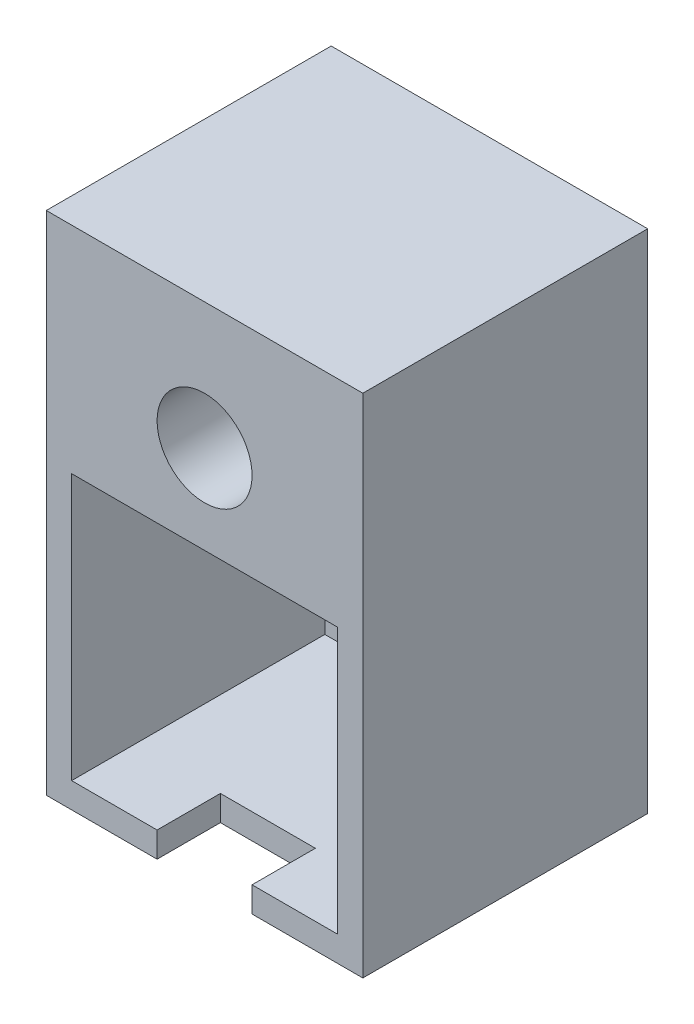
ISO-10303-21;
HEADER;
FILE_DESCRIPTION(('STEP AP214'),'2;1');
FILE_NAME('part.step','',(''),(''),'','','');
FILE_SCHEMA(('AUTOMOTIVE_DESIGN { 1 0 10303 214 1 1 1 1 }'));
ENDSEC;
DATA;
#1=APPLICATION_CONTEXT('core data for automotive mechanical design processes');
#2=APPLICATION_PROTOCOL_DEFINITION('international standard','automotive_design',2000,#1);
#3=PRODUCT_CONTEXT('',#1,'mechanical');
#4=PRODUCT('Part','Part','',(#3));
#5=PRODUCT_RELATED_PRODUCT_CATEGORY('part','',(#4));
#6=PRODUCT_DEFINITION_FORMATION('','',#4);
#7=PRODUCT_DEFINITION_CONTEXT('part definition',#1,'design');
#8=PRODUCT_DEFINITION('design','',#6,#7);
#9=PRODUCT_DEFINITION_SHAPE('','',#8);
#10=(LENGTH_UNIT() NAMED_UNIT(*) SI_UNIT(.MILLI.,.METRE.));
#11=(NAMED_UNIT(*) PLANE_ANGLE_UNIT() SI_UNIT($,.RADIAN.));
#12=(NAMED_UNIT(*) SI_UNIT($,.STERADIAN.) SOLID_ANGLE_UNIT());
#13=UNCERTAINTY_MEASURE_WITH_UNIT(LENGTH_MEASURE(1.E-05),#10,'distance_accuracy_value','');
#14=(GEOMETRIC_REPRESENTATION_CONTEXT(3) GLOBAL_UNCERTAINTY_ASSIGNED_CONTEXT((#13)) GLOBAL_UNIT_ASSIGNED_CONTEXT((#10,
#11,#12)) REPRESENTATION_CONTEXT('',''));
#15=CARTESIAN_POINT('',(0.,0.,0.));
#16=DIRECTION('',(0.,0.,1.));
#17=DIRECTION('',(1.,0.,0.));
#18=AXIS2_PLACEMENT_3D('',#15,#16,#17);
#19=CARTESIAN_POINT('',(-25.,-40.,45.));
#20=DIRECTION('',(1.,0.,0.));
#21=DIRECTION('',(0.,0.,-1.));
#22=AXIS2_PLACEMENT_3D('',#19,#20,#21);
#23=PLANE('',#22);
#24=DIRECTION('',(0.,-1.,0.));
#25=VECTOR('',#24,1.);
#26=CARTESIAN_POINT('',(-25.,-40.,0.));
#27=LINE('',#26,#25);
#28=CARTESIAN_POINT('',(-25.,40.,0.));
#29=VERTEX_POINT('',#28);
#30=CARTESIAN_POINT('',(-25.,-40.,0.));
#31=VERTEX_POINT('',#30);
#32=EDGE_CURVE('E157',#29,#31,#27,.T.);
#33=ORIENTED_EDGE('',*,*,#32,.T.);
#34=DIRECTION('',(0.,0.,-1.));
#35=VECTOR('',#34,1.);
#36=CARTESIAN_POINT('',(-25.,-40.,45.));
#37=LINE('',#36,#35);
#38=CARTESIAN_POINT('',(-25.,-40.,45.));
#39=VERTEX_POINT('',#38);
#40=EDGE_CURVE('E190',#39,#31,#37,.T.);
#41=ORIENTED_EDGE('',*,*,#40,.F.);
#42=DIRECTION('',(0.,-1.,0.));
#43=VECTOR('',#42,1.);
#44=CARTESIAN_POINT('',(-25.,-40.,45.));
#45=LINE('',#44,#43);
#46=CARTESIAN_POINT('',(-25.,40.,45.));
#47=VERTEX_POINT('',#46);
#48=EDGE_CURVE('E165',#47,#39,#45,.T.);
#49=ORIENTED_EDGE('',*,*,#48,.F.);
#50=DIRECTION('',(0.,0.,-1.));
#51=VECTOR('',#50,1.);
#52=CARTESIAN_POINT('',(-25.,40.,45.));
#53=LINE('',#52,#51);
#54=EDGE_CURVE('E174',#47,#29,#53,.T.);
#55=ORIENTED_EDGE('',*,*,#54,.T.);
#56=EDGE_LOOP('',(#33,#41,#49,#55));
#57=FACE_BOUND('',#56,.T.);
#58=ADVANCED_FACE('F33',(#57),#23,.F.);
#59=CARTESIAN_POINT('',(25.,-40.,45.));
#60=DIRECTION('',(0.,1.,0.));
#61=DIRECTION('',(-1.,0.,0.));
#62=AXIS2_PLACEMENT_3D('',#59,#60,#61);
#63=PLANE('',#62);
#64=DIRECTION('',(1.,0.,0.));
#65=VECTOR('',#64,1.);
#66=CARTESIAN_POINT('',(25.,-40.,35.));
#67=LINE('',#66,#65);
#68=CARTESIAN_POINT('',(-7.5,-40.,35.));
#69=VERTEX_POINT('',#68);
#70=CARTESIAN_POINT('',(7.5,-40.,35.));
#71=VERTEX_POINT('',#70);
#72=EDGE_CURVE('E263',#69,#71,#67,.T.);
#73=ORIENTED_EDGE('',*,*,#72,.F.);
#74=DIRECTION('',(0.,0.,1.));
#75=VECTOR('',#74,1.);
#76=CARTESIAN_POINT('',(-7.5,-40.,45.));
#77=LINE('',#76,#75);
#78=CARTESIAN_POINT('',(-7.5,-40.,45.));
#79=VERTEX_POINT('',#78);
#80=EDGE_CURVE('E254',#69,#79,#77,.T.);
#81=ORIENTED_EDGE('',*,*,#80,.T.);
#82=DIRECTION('',(1.,0.,0.));
#83=VECTOR('',#82,1.);
#84=CARTESIAN_POINT('',(25.,-40.,45.));
#85=LINE('',#84,#83);
#86=EDGE_CURVE('E136',#39,#79,#85,.T.);
#87=ORIENTED_EDGE('',*,*,#86,.F.);
#88=ORIENTED_EDGE('',*,*,#40,.T.);
#89=DIRECTION('',(1.,0.,0.));
#90=VECTOR('',#89,1.);
#91=CARTESIAN_POINT('',(25.,-40.,0.));
#92=LINE('',#91,#90);
#93=CARTESIAN_POINT('',(25.,-40.,0.));
#94=VERTEX_POINT('',#93);
#95=EDGE_CURVE('E177',#31,#94,#92,.T.);
#96=ORIENTED_EDGE('',*,*,#95,.T.);
#97=DIRECTION('',(0.,0.,-1.));
#98=VECTOR('',#97,1.);
#99=CARTESIAN_POINT('',(25.,-40.,45.));
#100=LINE('',#99,#98);
#101=CARTESIAN_POINT('',(25.,-40.,45.));
#102=VERTEX_POINT('',#101);
#103=EDGE_CURVE('E187',#102,#94,#100,.T.);
#104=ORIENTED_EDGE('',*,*,#103,.F.);
#105=CARTESIAN_POINT('',(7.5,-40.,45.));
#106=VERTEX_POINT('',#105);
#107=EDGE_CURVE('E167',#106,#102,#85,.T.);
#108=ORIENTED_EDGE('',*,*,#107,.F.);
#109=DIRECTION('',(0.,0.,-1.));
#110=VECTOR('',#109,1.);
#111=CARTESIAN_POINT('',(7.5,-40.,45.));
#112=LINE('',#111,#110);
#113=EDGE_CURVE('E262',#106,#71,#112,.T.);
#114=ORIENTED_EDGE('',*,*,#113,.T.);
#115=EDGE_LOOP('',(#73,#81,#87,#88,#96,#104,#108,#114));
#116=FACE_BOUND('',#115,.T.);
#117=ADVANCED_FACE('F238',(#116),#63,.F.);
#118=CARTESIAN_POINT('',(25.,-40.,45.));
#119=DIRECTION('',(-1.,0.,0.));
#120=DIRECTION('',(0.,0.,1.));
#121=AXIS2_PLACEMENT_3D('',#118,#119,#120);
#122=PLANE('',#121);
#123=DIRECTION('',(0.,1.,0.));
#124=VECTOR('',#123,1.);
#125=CARTESIAN_POINT('',(25.,-40.,0.));
#126=LINE('',#125,#124);
#127=CARTESIAN_POINT('',(25.,40.,0.));
#128=VERTEX_POINT('',#127);
#129=EDGE_CURVE('E179',#94,#128,#126,.T.);
#130=ORIENTED_EDGE('',*,*,#129,.T.);
#131=DIRECTION('',(0.,0.,-1.));
#132=VECTOR('',#131,1.);
#133=CARTESIAN_POINT('',(25.,40.,45.));
#134=LINE('',#133,#132);
#135=CARTESIAN_POINT('',(25.,40.,45.));
#136=VERTEX_POINT('',#135);
#137=EDGE_CURVE('E184',#136,#128,#134,.T.);
#138=ORIENTED_EDGE('',*,*,#137,.F.);
#139=DIRECTION('',(0.,1.,0.));
#140=VECTOR('',#139,1.);
#141=CARTESIAN_POINT('',(25.,-40.,45.));
#142=LINE('',#141,#140);
#143=EDGE_CURVE('E170',#102,#136,#142,.T.);
#144=ORIENTED_EDGE('',*,*,#143,.F.);
#145=ORIENTED_EDGE('',*,*,#103,.T.);
#146=EDGE_LOOP('',(#130,#138,#144,#145));
#147=FACE_BOUND('',#146,.T.);
#148=ADVANCED_FACE('F243',(#147),#122,.F.);
#149=CARTESIAN_POINT('',(25.,40.,45.));
#150=DIRECTION('',(0.,-1.,0.));
#151=DIRECTION('',(1.,0.,0.));
#152=AXIS2_PLACEMENT_3D('',#149,#150,#151);
#153=PLANE('',#152);
#154=DIRECTION('',(-1.,0.,0.));
#155=VECTOR('',#154,1.);
#156=CARTESIAN_POINT('',(25.,40.,0.));
#157=LINE('',#156,#155);
#158=EDGE_CURVE('E168',#128,#29,#157,.T.);
#159=ORIENTED_EDGE('',*,*,#158,.T.);
#160=ORIENTED_EDGE('',*,*,#54,.F.);
#161=DIRECTION('',(-1.,0.,0.));
#162=VECTOR('',#161,1.);
#163=CARTESIAN_POINT('',(25.,40.,45.));
#164=LINE('',#163,#162);
#165=EDGE_CURVE('E172',#136,#47,#164,.T.);
#166=ORIENTED_EDGE('',*,*,#165,.F.);
#167=ORIENTED_EDGE('',*,*,#137,.T.);
#168=EDGE_LOOP('',(#159,#160,#166,#167));
#169=FACE_BOUND('',#168,.T.);
#170=ADVANCED_FACE('F259',(#169),#153,.F.);
#171=CARTESIAN_POINT('',(0.,0.,45.));
#172=DIRECTION('',(0.,0.,1.));
#173=DIRECTION('',(1.,0.,0.));
#174=AXIS2_PLACEMENT_3D('',#171,#172,#173);
#175=PLANE('',#174);
#176=CARTESIAN_POINT('',(0.,20.,45.));
#177=DIRECTION('',(0.,0.,1.));
#178=DIRECTION('',(1.,0.,0.));
#179=AXIS2_PLACEMENT_3D('',#176,#177,#178);
#180=CIRCLE('',#179,7.5);
#181=CARTESIAN_POINT('',(7.5,20.,45.));
#182=VERTEX_POINT('',#181);
#183=EDGE_CURVE('E456',#182,#182,#180,.T.);
#184=ORIENTED_EDGE('',*,*,#183,.F.);
#185=EDGE_LOOP('',(#184));
#186=FACE_BOUND('',#185,.T.);
#187=DIRECTION('',(0.,-1.,0.));
#188=VECTOR('',#187,1.);
#189=CARTESIAN_POINT('',(-7.5,-60.844813350783,45.));
#190=LINE('',#189,#188);
#191=CARTESIAN_POINT('',(-7.5,-36.,45.));
#192=VERTEX_POINT('',#191);
#193=EDGE_CURVE('E123',#192,#79,#190,.T.);
#194=ORIENTED_EDGE('',*,*,#193,.F.);
#195=DIRECTION('',(1.,0.,0.));
#196=VECTOR('',#195,1.);
#197=CARTESIAN_POINT('',(21.,-36.,45.));
#198=LINE('',#197,#196);
#199=CARTESIAN_POINT('',(-21.,-36.,45.));
#200=VERTEX_POINT('',#199);
#201=EDGE_CURVE('E134',#200,#192,#198,.T.);
#202=ORIENTED_EDGE('',*,*,#201,.F.);
#203=DIRECTION('',(0.,-1.,0.));
#204=VECTOR('',#203,1.);
#205=CARTESIAN_POINT('',(-21.,6.00000000000001,45.));
#206=LINE('',#205,#204);
#207=CARTESIAN_POINT('',(-21.,6.00000000000001,45.));
#208=VERTEX_POINT('',#207);
#209=EDGE_CURVE('E56',#208,#200,#206,.T.);
#210=ORIENTED_EDGE('',*,*,#209,.F.);
#211=DIRECTION('',(-1.,0.,0.));
#212=VECTOR('',#211,1.);
#213=CARTESIAN_POINT('',(21.,6.00000000000001,45.));
#214=LINE('',#213,#212);
#215=CARTESIAN_POINT('',(21.,6.00000000000001,45.));
#216=VERTEX_POINT('',#215);
#217=EDGE_CURVE('E147',#216,#208,#214,.T.);
#218=ORIENTED_EDGE('',*,*,#217,.F.);
#219=DIRECTION('',(0.,1.,0.));
#220=VECTOR('',#219,1.);
#221=CARTESIAN_POINT('',(21.,6.00000000000001,45.));
#222=LINE('',#221,#220);
#223=CARTESIAN_POINT('',(21.,-36.,45.));
#224=VERTEX_POINT('',#223);
#225=EDGE_CURVE('E143',#224,#216,#222,.T.);
#226=ORIENTED_EDGE('',*,*,#225,.F.);
#227=CARTESIAN_POINT('',(7.5,-36.,45.));
#228=VERTEX_POINT('',#227);
#229=EDGE_CURVE('E144',#228,#224,#198,.T.);
#230=ORIENTED_EDGE('',*,*,#229,.F.);
#231=DIRECTION('',(0.,1.,0.));
#232=VECTOR('',#231,1.);
#233=CARTESIAN_POINT('',(7.5,-60.844813350783,45.));
#234=LINE('',#233,#232);
#235=EDGE_CURVE('E137',#106,#228,#234,.T.);
#236=ORIENTED_EDGE('',*,*,#235,.F.);
#237=ORIENTED_EDGE('',*,*,#107,.T.);
#238=ORIENTED_EDGE('',*,*,#143,.T.);
#239=ORIENTED_EDGE('',*,*,#165,.T.);
#240=ORIENTED_EDGE('',*,*,#48,.T.);
#241=ORIENTED_EDGE('',*,*,#86,.T.);
#242=EDGE_LOOP('',(#194,#202,#210,#218,#226,#230,#236,#237,#238,#239,#240,#241));
#243=FACE_BOUND('',#242,.T.);
#244=ADVANCED_FACE('F133',(#186,#243),#175,.T.);
#245=CARTESIAN_POINT('',(0.,0.,0.));
#246=DIRECTION('',(0.,0.,1.));
#247=DIRECTION('',(1.,0.,0.));
#248=AXIS2_PLACEMENT_3D('',#245,#246,#247);
#249=PLANE('',#248);
#250=CARTESIAN_POINT('',(0.,20.,0.));
#251=DIRECTION('',(0.,0.,-1.));
#252=DIRECTION('',(-1.,0.,0.));
#253=AXIS2_PLACEMENT_3D('',#250,#251,#252);
#254=CIRCLE('',#253,7.5);
#255=CARTESIAN_POINT('',(-7.5,20.,0.));
#256=VERTEX_POINT('',#255);
#257=EDGE_CURVE('E459',#256,#256,#254,.T.);
#258=ORIENTED_EDGE('',*,*,#257,.F.);
#259=EDGE_LOOP('',(#258));
#260=FACE_BOUND('',#259,.T.);
#261=CARTESIAN_POINT('',(0.,-15.,0.));
#262=DIRECTION('',(0.,0.,1.));
#263=DIRECTION('',(1.,0.,0.));
#264=AXIS2_PLACEMENT_3D('',#261,#262,#263);
#265=CIRCLE('',#264,2.);
#266=CARTESIAN_POINT('',(2.,-15.,0.));
#267=VERTEX_POINT('',#266);
#268=EDGE_CURVE('E36',#267,#267,#265,.T.);
#269=ORIENTED_EDGE('',*,*,#268,.T.);
#270=EDGE_LOOP('',(#269));
#271=FACE_BOUND('',#270,.T.);
#272=CARTESIAN_POINT('',(15.5,0.500000000000011,0.));
#273=DIRECTION('',(0.,0.,1.));
#274=DIRECTION('',(1.,0.,0.));
#275=AXIS2_PLACEMENT_3D('',#272,#273,#274);
#276=CIRCLE('',#275,1.5);
#277=CARTESIAN_POINT('',(17.,0.500000000000011,0.));
#278=VERTEX_POINT('',#277);
#279=EDGE_CURVE('E218',#278,#278,#276,.T.);
#280=ORIENTED_EDGE('',*,*,#279,.T.);
#281=EDGE_LOOP('',(#280));
#282=FACE_BOUND('',#281,.T.);
#283=CARTESIAN_POINT('',(-15.5,-30.5,0.));
#284=DIRECTION('',(0.,0.,1.));
#285=DIRECTION('',(1.,0.,0.));
#286=AXIS2_PLACEMENT_3D('',#283,#284,#285);
#287=CIRCLE('',#286,1.5);
#288=CARTESIAN_POINT('',(-14.,-30.5,0.));
#289=VERTEX_POINT('',#288);
#290=EDGE_CURVE('E286',#289,#289,#287,.T.);
#291=ORIENTED_EDGE('',*,*,#290,.T.);
#292=EDGE_LOOP('',(#291));
#293=FACE_BOUND('',#292,.T.);
#294=CARTESIAN_POINT('',(-15.5,0.500000000000014,0.));
#295=DIRECTION('',(0.,0.,1.));
#296=DIRECTION('',(1.,0.,0.));
#297=AXIS2_PLACEMENT_3D('',#294,#295,#296);
#298=CIRCLE('',#297,1.5);
#299=CARTESIAN_POINT('',(-14.,0.500000000000014,0.));
#300=VERTEX_POINT('',#299);
#301=EDGE_CURVE('E284',#300,#300,#298,.T.);
#302=ORIENTED_EDGE('',*,*,#301,.T.);
#303=EDGE_LOOP('',(#302));
#304=FACE_BOUND('',#303,.T.);
#305=CARTESIAN_POINT('',(15.5,-30.5,0.));
#306=DIRECTION('',(0.,0.,1.));
#307=DIRECTION('',(1.,0.,0.));
#308=AXIS2_PLACEMENT_3D('',#305,#306,#307);
#309=CIRCLE('',#308,1.5);
#310=CARTESIAN_POINT('',(17.,-30.5,0.));
#311=VERTEX_POINT('',#310);
#312=EDGE_CURVE('E281',#311,#311,#309,.T.);
#313=ORIENTED_EDGE('',*,*,#312,.T.);
#314=EDGE_LOOP('',(#313));
#315=FACE_BOUND('',#314,.T.);
#316=ORIENTED_EDGE('',*,*,#32,.F.);
#317=ORIENTED_EDGE('',*,*,#158,.F.);
#318=ORIENTED_EDGE('',*,*,#129,.F.);
#319=ORIENTED_EDGE('',*,*,#95,.F.);
#320=EDGE_LOOP('',(#316,#317,#318,#319));
#321=FACE_BOUND('',#320,.T.);
#322=ADVANCED_FACE('F225',(#260,#271,#282,#293,#304,#315,#321),#249,.F.);
#323=CARTESIAN_POINT('',(-21.,6.00000000000001,5.));
#324=DIRECTION('',(-1.,0.,0.));
#325=DIRECTION('',(0.,-1.,0.));
#326=AXIS2_PLACEMENT_3D('',#323,#324,#325);
#327=PLANE('',#326);
#328=ORIENTED_EDGE('',*,*,#209,.T.);
#329=DIRECTION('',(0.,0.,1.));
#330=VECTOR('',#329,1.);
#331=CARTESIAN_POINT('',(-21.,-36.,5.));
#332=LINE('',#331,#330);
#333=CARTESIAN_POINT('',(-21.,-36.,5.));
#334=VERTEX_POINT('',#333);
#335=EDGE_CURVE('E142',#334,#200,#332,.T.);
#336=ORIENTED_EDGE('',*,*,#335,.F.);
#337=DIRECTION('',(0.,-1.,0.));
#338=VECTOR('',#337,1.);
#339=CARTESIAN_POINT('',(-21.,6.00000000000001,5.));
#340=LINE('',#339,#338);
#341=CARTESIAN_POINT('',(-21.,6.00000000000001,5.));
#342=VERTEX_POINT('',#341);
#343=EDGE_CURVE('E154',#342,#334,#340,.T.);
#344=ORIENTED_EDGE('',*,*,#343,.F.);
#345=DIRECTION('',(0.,0.,1.));
#346=VECTOR('',#345,1.);
#347=CARTESIAN_POINT('',(-21.,6.00000000000001,5.));
#348=LINE('',#347,#346);
#349=EDGE_CURVE('E155',#342,#208,#348,.T.);
#350=ORIENTED_EDGE('',*,*,#349,.T.);
#351=EDGE_LOOP('',(#328,#336,#344,#350));
#352=FACE_BOUND('',#351,.T.);
#353=ADVANCED_FACE('F223',(#352),#327,.F.);
#354=CARTESIAN_POINT('',(21.,6.00000000000001,5.));
#355=DIRECTION('',(0.,1.,0.));
#356=DIRECTION('',(-1.,0.,0.));
#357=AXIS2_PLACEMENT_3D('',#354,#355,#356);
#358=PLANE('',#357);
#359=ORIENTED_EDGE('',*,*,#217,.T.);
#360=ORIENTED_EDGE('',*,*,#349,.F.);
#361=DIRECTION('',(-1.,0.,0.));
#362=VECTOR('',#361,1.);
#363=CARTESIAN_POINT('',(21.,6.00000000000001,5.));
#364=LINE('',#363,#362);
#365=CARTESIAN_POINT('',(21.,6.00000000000001,5.));
#366=VERTEX_POINT('',#365);
#367=EDGE_CURVE('E164',#366,#342,#364,.T.);
#368=ORIENTED_EDGE('',*,*,#367,.F.);
#369=DIRECTION('',(0.,0.,1.));
#370=VECTOR('',#369,1.);
#371=CARTESIAN_POINT('',(21.,6.00000000000001,5.));
#372=LINE('',#371,#370);
#373=EDGE_CURVE('E158',#366,#216,#372,.T.);
#374=ORIENTED_EDGE('',*,*,#373,.T.);
#375=EDGE_LOOP('',(#359,#360,#368,#374));
#376=FACE_BOUND('',#375,.T.);
#377=ADVANCED_FACE('F222',(#376),#358,.F.);
#378=CARTESIAN_POINT('',(21.,6.00000000000001,5.));
#379=DIRECTION('',(1.,0.,0.));
#380=DIRECTION('',(0.,1.,0.));
#381=AXIS2_PLACEMENT_3D('',#378,#379,#380);
#382=PLANE('',#381);
#383=ORIENTED_EDGE('',*,*,#225,.T.);
#384=ORIENTED_EDGE('',*,*,#373,.F.);
#385=DIRECTION('',(0.,1.,0.));
#386=VECTOR('',#385,1.);
#387=CARTESIAN_POINT('',(21.,6.00000000000001,5.));
#388=LINE('',#387,#386);
#389=CARTESIAN_POINT('',(21.,-36.,5.));
#390=VERTEX_POINT('',#389);
#391=EDGE_CURVE('E206',#390,#366,#388,.T.);
#392=ORIENTED_EDGE('',*,*,#391,.F.);
#393=DIRECTION('',(0.,0.,1.));
#394=VECTOR('',#393,1.);
#395=CARTESIAN_POINT('',(21.,-36.,5.));
#396=LINE('',#395,#394);
#397=EDGE_CURVE('E160',#390,#224,#396,.T.);
#398=ORIENTED_EDGE('',*,*,#397,.T.);
#399=EDGE_LOOP('',(#383,#384,#392,#398));
#400=FACE_BOUND('',#399,.T.);
#401=ADVANCED_FACE('F203',(#400),#382,.F.);
#402=CARTESIAN_POINT('',(21.,-36.,5.));
#403=DIRECTION('',(0.,-1.,0.));
#404=DIRECTION('',(1.,0.,0.));
#405=AXIS2_PLACEMENT_3D('',#402,#403,#404);
#406=PLANE('',#405);
#407=ORIENTED_EDGE('',*,*,#201,.T.);
#408=DIRECTION('',(0.,0.,-1.));
#409=VECTOR('',#408,1.);
#410=CARTESIAN_POINT('',(-7.5,-36.,5.));
#411=LINE('',#410,#409);
#412=CARTESIAN_POINT('',(-7.5,-36.,35.));
#413=VERTEX_POINT('',#412);
#414=EDGE_CURVE('E11',#192,#413,#411,.T.);
#415=ORIENTED_EDGE('',*,*,#414,.T.);
#416=DIRECTION('',(-1.,0.,0.));
#417=VECTOR('',#416,1.);
#418=CARTESIAN_POINT('',(21.,-36.,35.));
#419=LINE('',#418,#417);
#420=CARTESIAN_POINT('',(7.5,-36.,35.));
#421=VERTEX_POINT('',#420);
#422=EDGE_CURVE('E193',#421,#413,#419,.T.);
#423=ORIENTED_EDGE('',*,*,#422,.F.);
#424=DIRECTION('',(0.,0.,1.));
#425=VECTOR('',#424,1.);
#426=CARTESIAN_POINT('',(7.5,-36.,5.));
#427=LINE('',#426,#425);
#428=EDGE_CURVE('E41',#421,#228,#427,.T.);
#429=ORIENTED_EDGE('',*,*,#428,.T.);
#430=ORIENTED_EDGE('',*,*,#229,.T.);
#431=ORIENTED_EDGE('',*,*,#397,.F.);
#432=DIRECTION('',(1.,0.,0.));
#433=VECTOR('',#432,1.);
#434=CARTESIAN_POINT('',(21.,-36.,5.));
#435=LINE('',#434,#433);
#436=EDGE_CURVE('E208',#334,#390,#435,.T.);
#437=ORIENTED_EDGE('',*,*,#436,.F.);
#438=ORIENTED_EDGE('',*,*,#335,.T.);
#439=EDGE_LOOP('',(#407,#415,#423,#429,#430,#431,#437,#438));
#440=FACE_BOUND('',#439,.T.);
#441=ADVANCED_FACE('F140',(#440),#406,.F.);
#442=CARTESIAN_POINT('',(0.,0.,5.));
#443=DIRECTION('',(0.,0.,-1.));
#444=DIRECTION('',(-1.,0.,0.));
#445=AXIS2_PLACEMENT_3D('',#442,#443,#444);
#446=PLANE('',#445);
#447=CARTESIAN_POINT('',(0.,-15.,5.));
#448=DIRECTION('',(0.,0.,1.));
#449=DIRECTION('',(1.,0.,0.));
#450=AXIS2_PLACEMENT_3D('',#447,#448,#449);
#451=CIRCLE('',#450,11.);
#452=CARTESIAN_POINT('',(11.,-15.,5.));
#453=VERTEX_POINT('',#452);
#454=EDGE_CURVE('E448',#453,#453,#451,.T.);
#455=ORIENTED_EDGE('',*,*,#454,.F.);
#456=EDGE_LOOP('',(#455));
#457=FACE_BOUND('',#456,.T.);
#458=CARTESIAN_POINT('',(15.5,0.500000000000011,5.));
#459=DIRECTION('',(0.,0.,1.));
#460=DIRECTION('',(-1.,0.,0.));
#461=AXIS2_PLACEMENT_3D('',#458,#459,#460);
#462=CIRCLE('',#461,1.5);
#463=CARTESIAN_POINT('',(14.,0.500000000000011,5.));
#464=VERTEX_POINT('',#463);
#465=EDGE_CURVE('E273',#464,#464,#462,.T.);
#466=ORIENTED_EDGE('',*,*,#465,.F.);
#467=EDGE_LOOP('',(#466));
#468=FACE_BOUND('',#467,.T.);
#469=CARTESIAN_POINT('',(-15.5,-30.5,5.));
#470=DIRECTION('',(0.,0.,1.));
#471=DIRECTION('',(-1.,0.,0.));
#472=AXIS2_PLACEMENT_3D('',#469,#470,#471);
#473=CIRCLE('',#472,1.5);
#474=CARTESIAN_POINT('',(-17.,-30.5,5.));
#475=VERTEX_POINT('',#474);
#476=EDGE_CURVE('E272',#475,#475,#473,.T.);
#477=ORIENTED_EDGE('',*,*,#476,.F.);
#478=EDGE_LOOP('',(#477));
#479=FACE_BOUND('',#478,.T.);
#480=CARTESIAN_POINT('',(-15.5,0.500000000000014,5.));
#481=DIRECTION('',(0.,0.,1.));
#482=DIRECTION('',(1.,0.,0.));
#483=AXIS2_PLACEMENT_3D('',#480,#481,#482);
#484=CIRCLE('',#483,1.5);
#485=CARTESIAN_POINT('',(-14.,0.500000000000014,5.));
#486=VERTEX_POINT('',#485);
#487=EDGE_CURVE('E265',#486,#486,#484,.T.);
#488=ORIENTED_EDGE('',*,*,#487,.F.);
#489=EDGE_LOOP('',(#488));
#490=FACE_BOUND('',#489,.T.);
#491=CARTESIAN_POINT('',(15.5,-30.5,5.));
#492=DIRECTION('',(0.,0.,1.));
#493=DIRECTION('',(1.,0.,0.));
#494=AXIS2_PLACEMENT_3D('',#491,#492,#493);
#495=CIRCLE('',#494,1.5);
#496=CARTESIAN_POINT('',(17.,-30.5,5.));
#497=VERTEX_POINT('',#496);
#498=EDGE_CURVE('E276',#497,#497,#495,.T.);
#499=ORIENTED_EDGE('',*,*,#498,.F.);
#500=EDGE_LOOP('',(#499));
#501=FACE_BOUND('',#500,.T.);
#502=ORIENTED_EDGE('',*,*,#343,.T.);
#503=ORIENTED_EDGE('',*,*,#436,.T.);
#504=ORIENTED_EDGE('',*,*,#391,.T.);
#505=ORIENTED_EDGE('',*,*,#367,.T.);
#506=EDGE_LOOP('',(#502,#503,#504,#505));
#507=FACE_BOUND('',#506,.T.);
#508=ADVANCED_FACE('F214',(#457,#468,#479,#490,#501,#507),#446,.F.);
#509=CARTESIAN_POINT('',(15.5,-30.5,-35.));
#510=DIRECTION('',(0.,0.,1.));
#511=DIRECTION('',(1.,0.,0.));
#512=AXIS2_PLACEMENT_3D('',#509,#510,#511);
#513=CYLINDRICAL_SURFACE('',#512,1.5);
#514=ORIENTED_EDGE('',*,*,#498,.T.);
#515=EDGE_LOOP('',(#514));
#516=FACE_BOUND('',#515,.T.);
#517=ORIENTED_EDGE('',*,*,#312,.F.);
#518=EDGE_LOOP('',(#517));
#519=FACE_BOUND('',#518,.T.);
#520=ADVANCED_FACE('F310',(#516,#519),#513,.F.);
#521=CARTESIAN_POINT('',(-15.5,0.500000000000014,-35.));
#522=DIRECTION('',(0.,0.,1.));
#523=DIRECTION('',(1.,0.,0.));
#524=AXIS2_PLACEMENT_3D('',#521,#522,#523);
#525=CYLINDRICAL_SURFACE('',#524,1.5);
#526=ORIENTED_EDGE('',*,*,#487,.T.);
#527=EDGE_LOOP('',(#526));
#528=FACE_BOUND('',#527,.T.);
#529=ORIENTED_EDGE('',*,*,#301,.F.);
#530=EDGE_LOOP('',(#529));
#531=FACE_BOUND('',#530,.T.);
#532=ADVANCED_FACE('F305',(#528,#531),#525,.F.);
#533=CARTESIAN_POINT('',(-15.5,-30.5,-35.));
#534=DIRECTION('',(0.,0.,1.));
#535=DIRECTION('',(1.,0.,0.));
#536=AXIS2_PLACEMENT_3D('',#533,#534,#535);
#537=CYLINDRICAL_SURFACE('',#536,1.5);
#538=ORIENTED_EDGE('',*,*,#476,.T.);
#539=EDGE_LOOP('',(#538));
#540=FACE_BOUND('',#539,.T.);
#541=ORIENTED_EDGE('',*,*,#290,.F.);
#542=EDGE_LOOP('',(#541));
#543=FACE_BOUND('',#542,.T.);
#544=ADVANCED_FACE('F296',(#540,#543),#537,.F.);
#545=CARTESIAN_POINT('',(15.5,0.500000000000011,-35.));
#546=DIRECTION('',(0.,0.,1.));
#547=DIRECTION('',(1.,0.,0.));
#548=AXIS2_PLACEMENT_3D('',#545,#546,#547);
#549=CYLINDRICAL_SURFACE('',#548,1.5);
#550=ORIENTED_EDGE('',*,*,#465,.T.);
#551=EDGE_LOOP('',(#550));
#552=FACE_BOUND('',#551,.T.);
#553=ORIENTED_EDGE('',*,*,#279,.F.);
#554=EDGE_LOOP('',(#553));
#555=FACE_BOUND('',#554,.T.);
#556=ADVANCED_FACE('F294',(#552,#555),#549,.F.);
#557=CARTESIAN_POINT('',(-7.5,-60.844813350783,35.));
#558=DIRECTION('',(-1.,0.,0.));
#559=DIRECTION('',(0.,0.,1.));
#560=AXIS2_PLACEMENT_3D('',#557,#558,#559);
#561=PLANE('',#560);
#562=DIRECTION('',(0.,-1.,0.));
#563=VECTOR('',#562,1.);
#564=CARTESIAN_POINT('',(-7.5,-60.844813350783,35.));
#565=LINE('',#564,#563);
#566=EDGE_CURVE('E126',#413,#69,#565,.T.);
#567=ORIENTED_EDGE('',*,*,#566,.F.);
#568=ORIENTED_EDGE('',*,*,#414,.F.);
#569=ORIENTED_EDGE('',*,*,#193,.T.);
#570=ORIENTED_EDGE('',*,*,#80,.F.);
#571=EDGE_LOOP('',(#567,#568,#569,#570));
#572=FACE_BOUND('',#571,.T.);
#573=ADVANCED_FACE('F122',(#572),#561,.F.);
#574=CARTESIAN_POINT('',(7.5,-60.844813350783,35.));
#575=DIRECTION('',(1.,0.,0.));
#576=DIRECTION('',(0.,0.,-1.));
#577=AXIS2_PLACEMENT_3D('',#574,#575,#576);
#578=PLANE('',#577);
#579=ORIENTED_EDGE('',*,*,#235,.T.);
#580=ORIENTED_EDGE('',*,*,#428,.F.);
#581=DIRECTION('',(0.,1.,0.));
#582=VECTOR('',#581,1.);
#583=CARTESIAN_POINT('',(7.5,-60.844813350783,35.));
#584=LINE('',#583,#582);
#585=EDGE_CURVE('E48',#71,#421,#584,.T.);
#586=ORIENTED_EDGE('',*,*,#585,.F.);
#587=ORIENTED_EDGE('',*,*,#113,.F.);
#588=EDGE_LOOP('',(#579,#580,#586,#587));
#589=FACE_BOUND('',#588,.T.);
#590=ADVANCED_FACE('F303',(#589),#578,.F.);
#591=CARTESIAN_POINT('',(0.,0.,35.));
#592=DIRECTION('',(0.,0.,1.));
#593=DIRECTION('',(1.,0.,0.));
#594=AXIS2_PLACEMENT_3D('',#591,#592,#593);
#595=PLANE('',#594);
#596=ORIENTED_EDGE('',*,*,#72,.T.);
#597=ORIENTED_EDGE('',*,*,#585,.T.);
#598=ORIENTED_EDGE('',*,*,#422,.T.);
#599=ORIENTED_EDGE('',*,*,#566,.T.);
#600=EDGE_LOOP('',(#596,#597,#598,#599));
#601=FACE_BOUND('',#600,.T.);
#602=ADVANCED_FACE('F416',(#601),#595,.T.);
#603=CARTESIAN_POINT('',(0.,-15.,3.));
#604=DIRECTION('',(0.,0.,1.));
#605=DIRECTION('',(1.,0.,0.));
#606=AXIS2_PLACEMENT_3D('',#603,#604,#605);
#607=CYLINDRICAL_SURFACE('',#606,11.);
#608=CARTESIAN_POINT('',(0.,-15.,3.));
#609=DIRECTION('',(0.,0.,1.));
#610=DIRECTION('',(1.,0.,0.));
#611=AXIS2_PLACEMENT_3D('',#608,#609,#610);
#612=CIRCLE('',#611,11.);
#613=CARTESIAN_POINT('',(11.,-15.,3.));
#614=VERTEX_POINT('',#613);
#615=EDGE_CURVE('E138',#614,#614,#612,.T.);
#616=ORIENTED_EDGE('',*,*,#615,.F.);
#617=EDGE_LOOP('',(#616));
#618=FACE_BOUND('',#617,.T.);
#619=ORIENTED_EDGE('',*,*,#454,.T.);
#620=EDGE_LOOP('',(#619));
#621=FACE_BOUND('',#620,.T.);
#622=ADVANCED_FACE('F409',(#618,#621),#607,.F.);
#623=CARTESIAN_POINT('',(0.,-15.,3.));
#624=DIRECTION('',(0.,0.,1.));
#625=DIRECTION('',(1.,0.,0.));
#626=AXIS2_PLACEMENT_3D('',#623,#624,#625);
#627=PLANE('',#626);
#628=CARTESIAN_POINT('',(0.,-15.,3.));
#629=DIRECTION('',(0.,0.,1.));
#630=DIRECTION('',(1.,0.,0.));
#631=AXIS2_PLACEMENT_3D('',#628,#629,#630);
#632=CIRCLE('',#631,2.);
#633=CARTESIAN_POINT('',(2.,-15.,3.));
#634=VERTEX_POINT('',#633);
#635=EDGE_CURVE('E453',#634,#634,#632,.T.);
#636=ORIENTED_EDGE('',*,*,#635,.F.);
#637=EDGE_LOOP('',(#636));
#638=FACE_BOUND('',#637,.T.);
#639=ORIENTED_EDGE('',*,*,#615,.T.);
#640=EDGE_LOOP('',(#639));
#641=FACE_BOUND('',#640,.T.);
#642=ADVANCED_FACE('F402',(#638,#641),#627,.T.);
#643=CARTESIAN_POINT('',(0.,-15.,-7.));
#644=DIRECTION('',(0.,0.,1.));
#645=DIRECTION('',(1.,0.,0.));
#646=AXIS2_PLACEMENT_3D('',#643,#644,#645);
#647=CYLINDRICAL_SURFACE('',#646,2.);
#648=ORIENTED_EDGE('',*,*,#635,.T.);
#649=EDGE_LOOP('',(#648));
#650=FACE_BOUND('',#649,.T.);
#651=ORIENTED_EDGE('',*,*,#268,.F.);
#652=EDGE_LOOP('',(#651));
#653=FACE_BOUND('',#652,.T.);
#654=ADVANCED_FACE('F392',(#650,#653),#647,.F.);
#655=CARTESIAN_POINT('',(0.,20.,48.));
#656=DIRECTION('',(0.,0.,-1.));
#657=DIRECTION('',(-1.,0.,0.));
#658=AXIS2_PLACEMENT_3D('',#655,#656,#657);
#659=CYLINDRICAL_SURFACE('',#658,7.5);
#660=ORIENTED_EDGE('',*,*,#183,.T.);
#661=EDGE_LOOP('',(#660));
#662=FACE_BOUND('',#661,.T.);
#663=ORIENTED_EDGE('',*,*,#257,.T.);
#664=EDGE_LOOP('',(#663));
#665=FACE_BOUND('',#664,.T.);
#666=ADVANCED_FACE('F388',(#662,#665),#659,.F.);
#667=CLOSED_SHELL('',(#58,#117,#148,#170,#244,#322,#353,#377,#401,#441,#508,#520,#532,#544,#556,
#573,#590,#602,#622,#642,#654,#666));
#668=MANIFOLD_SOLID_BREP('B2',#667);
#669=ADVANCED_BREP_SHAPE_REPRESENTATION('',(#18,#668),#14);
#670=SHAPE_DEFINITION_REPRESENTATION(#9,#669);
ENDSEC;
END-ISO-10303-21;
